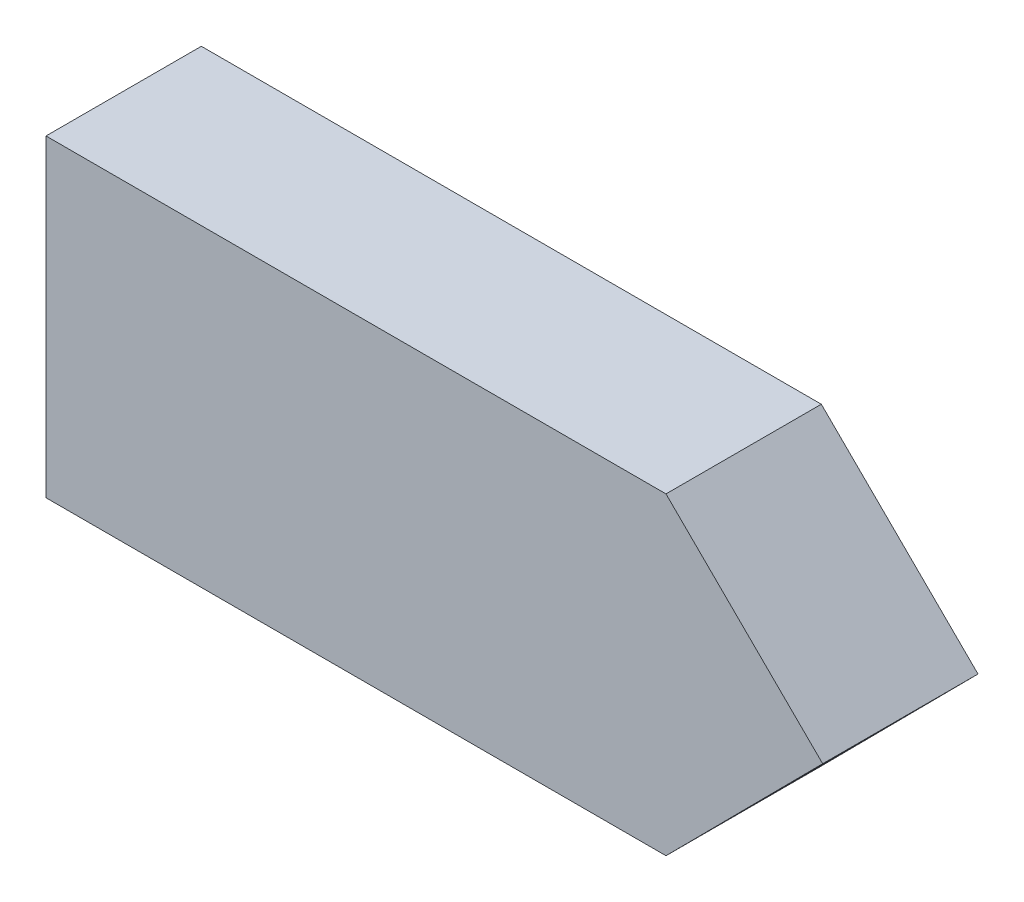
ISO-10303-21;
HEADER;
FILE_DESCRIPTION(('STEP AP214'),'2;1');
FILE_NAME('part.step','',(''),(''),'','','');
FILE_SCHEMA(('AUTOMOTIVE_DESIGN { 1 0 10303 214 1 1 1 1 }'));
ENDSEC;
DATA;
#1=APPLICATION_CONTEXT('core data for automotive mechanical design processes');
#2=APPLICATION_PROTOCOL_DEFINITION('international standard','automotive_design',2000,#1);
#3=PRODUCT_CONTEXT('',#1,'mechanical');
#4=PRODUCT('Part','Part','',(#3));
#5=PRODUCT_RELATED_PRODUCT_CATEGORY('part','',(#4));
#6=PRODUCT_DEFINITION_FORMATION('','',#4);
#7=PRODUCT_DEFINITION_CONTEXT('part definition',#1,'design');
#8=PRODUCT_DEFINITION('design','',#6,#7);
#9=PRODUCT_DEFINITION_SHAPE('','',#8);
#10=(LENGTH_UNIT() NAMED_UNIT(*) SI_UNIT(.MILLI.,.METRE.));
#11=(NAMED_UNIT(*) PLANE_ANGLE_UNIT() SI_UNIT($,.RADIAN.));
#12=(NAMED_UNIT(*) SI_UNIT($,.STERADIAN.) SOLID_ANGLE_UNIT());
#13=UNCERTAINTY_MEASURE_WITH_UNIT(LENGTH_MEASURE(1.E-05),#10,'distance_accuracy_value','');
#14=(GEOMETRIC_REPRESENTATION_CONTEXT(3) GLOBAL_UNCERTAINTY_ASSIGNED_CONTEXT((#13)) GLOBAL_UNIT_ASSIGNED_CONTEXT((#10,
#11,#12)) REPRESENTATION_CONTEXT('',''));
#15=CARTESIAN_POINT('',(0.,0.,0.));
#16=DIRECTION('',(0.,0.,1.));
#17=DIRECTION('',(1.,0.,0.));
#18=AXIS2_PLACEMENT_3D('',#15,#16,#17);
#19=CARTESIAN_POINT('',(-60.,19.8264196793657,10.));
#20=DIRECTION('',(1.,0.,0.));
#21=DIRECTION('',(0.,0.,-1.));
#22=AXIS2_PLACEMENT_3D('',#19,#20,#21);
#23=PLANE('',#22);
#24=DIRECTION('',(0.,-1.,0.));
#25=VECTOR('',#24,1.);
#26=CARTESIAN_POINT('',(-60.,19.8264196793657,0.));
#27=LINE('',#26,#25);
#28=CARTESIAN_POINT('',(-60.,40.,0.));
#29=VERTEX_POINT('',#28);
#30=CARTESIAN_POINT('',(-60.,19.8264196793657,0.));
#31=VERTEX_POINT('',#30);
#32=EDGE_CURVE('E111',#29,#31,#27,.T.);
#33=ORIENTED_EDGE('',*,*,#32,.T.);
#34=DIRECTION('',(0.,0.,-1.));
#35=VECTOR('',#34,1.);
#36=CARTESIAN_POINT('',(-60.,19.8264196793657,10.));
#37=LINE('',#36,#35);
#38=CARTESIAN_POINT('',(-60.,19.8264196793657,10.));
#39=VERTEX_POINT('',#38);
#40=EDGE_CURVE('E11',#39,#31,#37,.T.);
#41=ORIENTED_EDGE('',*,*,#40,.F.);
#42=DIRECTION('',(0.,-1.,0.));
#43=VECTOR('',#42,1.);
#44=CARTESIAN_POINT('',(-60.,19.8264196793657,10.));
#45=LINE('',#44,#43);
#46=CARTESIAN_POINT('',(-60.,40.,10.));
#47=VERTEX_POINT('',#46);
#48=EDGE_CURVE('E119',#47,#39,#45,.T.);
#49=ORIENTED_EDGE('',*,*,#48,.F.);
#50=DIRECTION('',(0.,0.,-1.));
#51=VECTOR('',#50,1.);
#52=CARTESIAN_POINT('',(-60.,40.,10.));
#53=LINE('',#52,#51);
#54=EDGE_CURVE('E107',#47,#29,#53,.T.);
#55=ORIENTED_EDGE('',*,*,#54,.T.);
#56=EDGE_LOOP('',(#33,#41,#49,#55));
#57=FACE_BOUND('',#56,.T.);
#58=ADVANCED_FACE('F37',(#57),#23,.F.);
#59=CARTESIAN_POINT('',(-20.0864167674325,19.8264196793657,10.));
#60=DIRECTION('',(0.,1.,0.));
#61=DIRECTION('',(0.,0.,1.));
#62=AXIS2_PLACEMENT_3D('',#59,#60,#61);
#63=PLANE('',#62);
#64=DIRECTION('',(1.,0.,0.));
#65=VECTOR('',#64,1.);
#66=CARTESIAN_POINT('',(-20.0864167674325,19.8264196793657,0.));
#67=LINE('',#66,#65);
#68=CARTESIAN_POINT('',(-20.0864167674325,19.8264196793657,0.));
#69=VERTEX_POINT('',#68);
#70=EDGE_CURVE('E114',#31,#69,#67,.T.);
#71=ORIENTED_EDGE('',*,*,#70,.T.);
#72=DIRECTION('',(0.,0.,-1.));
#73=VECTOR('',#72,1.);
#74=CARTESIAN_POINT('',(-20.0864167674325,19.8264196793657,10.));
#75=LINE('',#74,#73);
#76=CARTESIAN_POINT('',(-20.0864167674325,19.8264196793657,10.));
#77=VERTEX_POINT('',#76);
#78=EDGE_CURVE('E45',#77,#69,#75,.T.);
#79=ORIENTED_EDGE('',*,*,#78,.F.);
#80=DIRECTION('',(1.,0.,0.));
#81=VECTOR('',#80,1.);
#82=CARTESIAN_POINT('',(-20.0864167674325,19.8264196793657,10.));
#83=LINE('',#82,#81);
#84=EDGE_CURVE('E87',#39,#77,#83,.T.);
#85=ORIENTED_EDGE('',*,*,#84,.F.);
#86=ORIENTED_EDGE('',*,*,#40,.T.);
#87=EDGE_LOOP('',(#71,#79,#85,#86));
#88=FACE_BOUND('',#87,.T.);
#89=ADVANCED_FACE('F138',(#88),#63,.F.);
#90=CARTESIAN_POINT('',(-10.,30.,10.));
#91=DIRECTION('',(-0.71014235855813,0.704058115911959,0.));
#92=DIRECTION('',(-0.704058115911959,-0.71014235855813,0.));
#93=AXIS2_PLACEMENT_3D('',#90,#91,#92);
#94=PLANE('',#93);
#95=DIRECTION('',(0.704058115911959,0.71014235855813,0.));
#96=VECTOR('',#95,1.);
#97=CARTESIAN_POINT('',(-10.,30.,0.));
#98=LINE('',#97,#96);
#99=CARTESIAN_POINT('',(-10.,30.,0.));
#100=VERTEX_POINT('',#99);
#101=EDGE_CURVE('E102',#69,#100,#98,.T.);
#102=ORIENTED_EDGE('',*,*,#101,.T.);
#103=DIRECTION('',(0.,0.,-1.));
#104=VECTOR('',#103,1.);
#105=CARTESIAN_POINT('',(-10.,30.,10.));
#106=LINE('',#105,#104);
#107=CARTESIAN_POINT('',(-10.,30.,10.));
#108=VERTEX_POINT('',#107);
#109=EDGE_CURVE('E99',#108,#100,#106,.T.);
#110=ORIENTED_EDGE('',*,*,#109,.F.);
#111=DIRECTION('',(0.704058115911959,0.71014235855813,0.));
#112=VECTOR('',#111,1.);
#113=CARTESIAN_POINT('',(-10.,30.,10.));
#114=LINE('',#113,#112);
#115=EDGE_CURVE('E91',#77,#108,#114,.T.);
#116=ORIENTED_EDGE('',*,*,#115,.F.);
#117=ORIENTED_EDGE('',*,*,#78,.T.);
#118=EDGE_LOOP('',(#102,#110,#116,#117));
#119=FACE_BOUND('',#118,.T.);
#120=ADVANCED_FACE('F100',(#119),#94,.F.);
#121=CARTESIAN_POINT('',(-20.0864167674325,40.,10.));
#122=DIRECTION('',(-0.704058115911959,-0.71014235855813,0.));
#123=DIRECTION('',(0.71014235855813,-0.704058115911959,0.));
#124=AXIS2_PLACEMENT_3D('',#121,#122,#123);
#125=PLANE('',#124);
#126=DIRECTION('',(-0.71014235855813,0.704058115911959,0.));
#127=VECTOR('',#126,1.);
#128=CARTESIAN_POINT('',(-20.0864167674325,40.,0.));
#129=LINE('',#128,#127);
#130=CARTESIAN_POINT('',(-20.0864167674325,40.,0.));
#131=VERTEX_POINT('',#130);
#132=EDGE_CURVE('E73',#100,#131,#129,.T.);
#133=ORIENTED_EDGE('',*,*,#132,.T.);
#134=DIRECTION('',(0.,0.,-1.));
#135=VECTOR('',#134,1.);
#136=CARTESIAN_POINT('',(-20.0864167674325,40.,10.));
#137=LINE('',#136,#135);
#138=CARTESIAN_POINT('',(-20.0864167674325,40.,10.));
#139=VERTEX_POINT('',#138);
#140=EDGE_CURVE('E103',#139,#131,#137,.T.);
#141=ORIENTED_EDGE('',*,*,#140,.F.);
#142=DIRECTION('',(-0.71014235855813,0.704058115911959,0.));
#143=VECTOR('',#142,1.);
#144=CARTESIAN_POINT('',(-20.0864167674325,40.,10.));
#145=LINE('',#144,#143);
#146=EDGE_CURVE('E95',#108,#139,#145,.T.);
#147=ORIENTED_EDGE('',*,*,#146,.F.);
#148=ORIENTED_EDGE('',*,*,#109,.T.);
#149=EDGE_LOOP('',(#133,#141,#147,#148));
#150=FACE_BOUND('',#149,.T.);
#151=ADVANCED_FACE('F105',(#150),#125,.F.);
#152=CARTESIAN_POINT('',(-60.,40.,10.));
#153=DIRECTION('',(0.,-1.,0.));
#154=DIRECTION('',(0.,0.,-1.));
#155=AXIS2_PLACEMENT_3D('',#152,#153,#154);
#156=PLANE('',#155);
#157=DIRECTION('',(-1.,0.,0.));
#158=VECTOR('',#157,1.);
#159=CARTESIAN_POINT('',(-60.,40.,0.));
#160=LINE('',#159,#158);
#161=EDGE_CURVE('E79',#131,#29,#160,.T.);
#162=ORIENTED_EDGE('',*,*,#161,.T.);
#163=ORIENTED_EDGE('',*,*,#54,.F.);
#164=DIRECTION('',(-1.,0.,0.));
#165=VECTOR('',#164,1.);
#166=CARTESIAN_POINT('',(-60.,40.,10.));
#167=LINE('',#166,#165);
#168=EDGE_CURVE('E53',#139,#47,#167,.T.);
#169=ORIENTED_EDGE('',*,*,#168,.F.);
#170=ORIENTED_EDGE('',*,*,#140,.T.);
#171=EDGE_LOOP('',(#162,#163,#169,#170));
#172=FACE_BOUND('',#171,.T.);
#173=ADVANCED_FACE('F127',(#172),#156,.F.);
#174=CARTESIAN_POINT('',(0.,0.,10.));
#175=DIRECTION('',(0.,0.,-1.));
#176=DIRECTION('',(-1.,0.,0.));
#177=AXIS2_PLACEMENT_3D('',#174,#175,#176);
#178=PLANE('',#177);
#179=ORIENTED_EDGE('',*,*,#48,.T.);
#180=ORIENTED_EDGE('',*,*,#84,.T.);
#181=ORIENTED_EDGE('',*,*,#115,.T.);
#182=ORIENTED_EDGE('',*,*,#146,.T.);
#183=ORIENTED_EDGE('',*,*,#168,.T.);
#184=EDGE_LOOP('',(#179,#180,#181,#182,#183));
#185=FACE_BOUND('',#184,.T.);
#186=ADVANCED_FACE('F93',(#185),#178,.F.);
#187=CARTESIAN_POINT('',(0.,0.,0.));
#188=DIRECTION('',(0.,0.,-1.));
#189=DIRECTION('',(-1.,0.,0.));
#190=AXIS2_PLACEMENT_3D('',#187,#188,#189);
#191=PLANE('',#190);
#192=ORIENTED_EDGE('',*,*,#32,.F.);
#193=ORIENTED_EDGE('',*,*,#161,.F.);
#194=ORIENTED_EDGE('',*,*,#132,.F.);
#195=ORIENTED_EDGE('',*,*,#101,.F.);
#196=ORIENTED_EDGE('',*,*,#70,.F.);
#197=EDGE_LOOP('',(#192,#193,#194,#195,#196));
#198=FACE_BOUND('',#197,.T.);
#199=ADVANCED_FACE('F123',(#198),#191,.T.);
#200=CLOSED_SHELL('',(#58,#89,#120,#151,#173,#186,#199));
#201=MANIFOLD_SOLID_BREP('B2',#200);
#202=ADVANCED_BREP_SHAPE_REPRESENTATION('',(#18,#201),#14);
#203=SHAPE_DEFINITION_REPRESENTATION(#9,#202);
ENDSEC;
END-ISO-10303-21;
